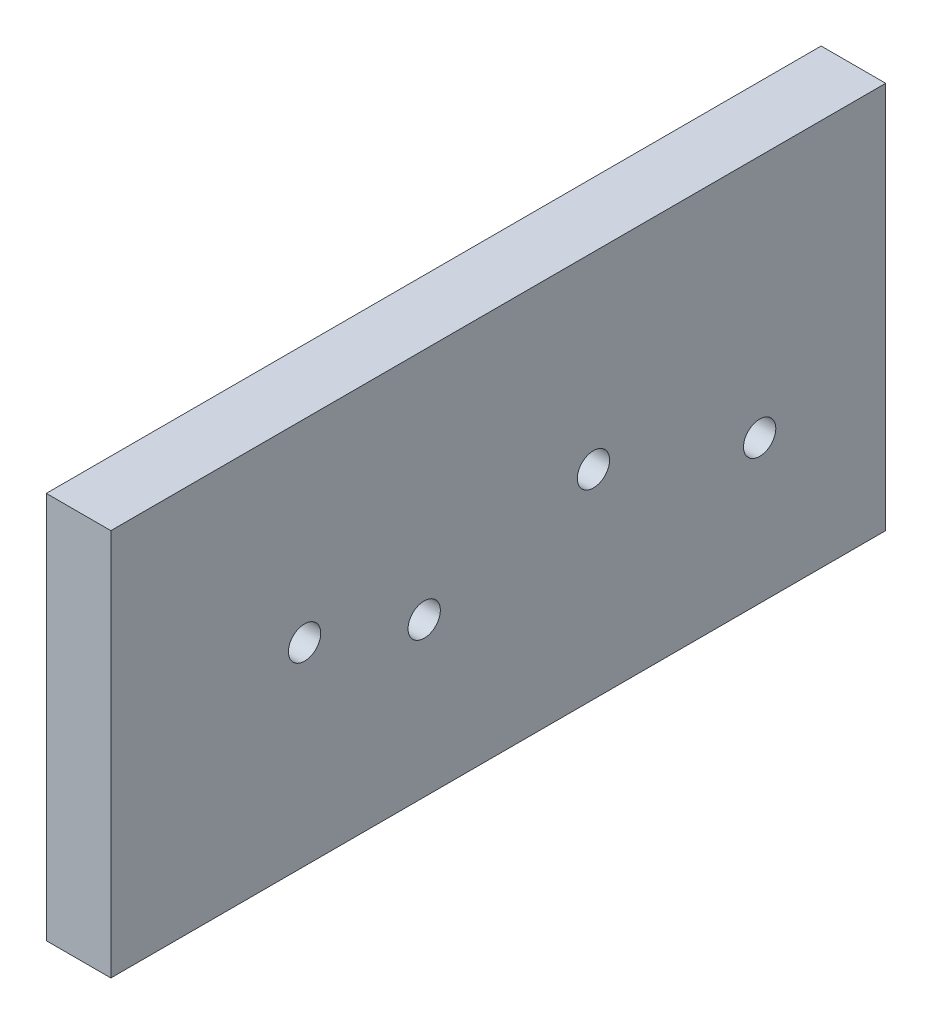
ISO-10303-21;
HEADER;
FILE_DESCRIPTION(('STEP AP214'),'2;1');
FILE_NAME('part.step','',(''),(''),'','','');
FILE_SCHEMA(('AUTOMOTIVE_DESIGN { 1 0 10303 214 1 1 1 1 }'));
ENDSEC;
DATA;
#1=APPLICATION_CONTEXT('core data for automotive mechanical design processes');
#2=APPLICATION_PROTOCOL_DEFINITION('international standard','automotive_design',2000,#1);
#3=PRODUCT_CONTEXT('',#1,'mechanical');
#4=PRODUCT('Part','Part','',(#3));
#5=PRODUCT_RELATED_PRODUCT_CATEGORY('part','',(#4));
#6=PRODUCT_DEFINITION_FORMATION('','',#4);
#7=PRODUCT_DEFINITION_CONTEXT('part definition',#1,'design');
#8=PRODUCT_DEFINITION('design','',#6,#7);
#9=PRODUCT_DEFINITION_SHAPE('','',#8);
#10=(LENGTH_UNIT() NAMED_UNIT(*) SI_UNIT(.MILLI.,.METRE.));
#11=(NAMED_UNIT(*) PLANE_ANGLE_UNIT() SI_UNIT($,.RADIAN.));
#12=(NAMED_UNIT(*) SI_UNIT($,.STERADIAN.) SOLID_ANGLE_UNIT());
#13=UNCERTAINTY_MEASURE_WITH_UNIT(LENGTH_MEASURE(1.E-05),#10,'distance_accuracy_value','');
#14=(GEOMETRIC_REPRESENTATION_CONTEXT(3) GLOBAL_UNCERTAINTY_ASSIGNED_CONTEXT((#13)) GLOBAL_UNIT_ASSIGNED_CONTEXT((#10,
#11,#12)) REPRESENTATION_CONTEXT('',''));
#15=CARTESIAN_POINT('',(0.,0.,0.));
#16=DIRECTION('',(0.,0.,1.));
#17=DIRECTION('',(1.,0.,0.));
#18=AXIS2_PLACEMENT_3D('',#15,#16,#17);
#19=CARTESIAN_POINT('',(12.7,-9.873506971,-51.4082559918149));
#20=DIRECTION('',(-1.,0.,0.));
#21=DIRECTION('',(0.,0.,1.));
#22=AXIS2_PLACEMENT_3D('',#19,#20,#21);
#23=CYLINDRICAL_SURFACE('',#22,3.175);
#24=CARTESIAN_POINT('',(12.7,-9.873506971,-51.4082559918149));
#25=DIRECTION('',(1.,0.,0.));
#26=DIRECTION('',(0.,0.,-1.));
#27=AXIS2_PLACEMENT_3D('',#24,#25,#26);
#28=CIRCLE('',#27,3.175);
#29=CARTESIAN_POINT('',(12.7,-9.873506971,-54.5832559918149));
#30=VERTEX_POINT('',#29);
#31=EDGE_CURVE('E191',#30,#30,#28,.T.);
#32=ORIENTED_EDGE('',*,*,#31,.T.);
#33=EDGE_LOOP('',(#32));
#34=FACE_BOUND('',#33,.T.);
#35=CARTESIAN_POINT('',(6.35,-9.873506971,-51.4082559918149));
#36=DIRECTION('',(-1.,0.,0.));
#37=DIRECTION('',(0.,0.,1.));
#38=AXIS2_PLACEMENT_3D('',#35,#36,#37);
#39=CIRCLE('',#38,3.175);
#40=CARTESIAN_POINT('',(6.35,-9.873506971,-48.2332559918149));
#41=VERTEX_POINT('',#40);
#42=EDGE_CURVE('E51',#41,#41,#39,.T.);
#43=ORIENTED_EDGE('',*,*,#42,.T.);
#44=EDGE_LOOP('',(#43));
#45=FACE_BOUND('',#44,.T.);
#46=ADVANCED_FACE('F47',(#34,#45),#23,.F.);
#47=CARTESIAN_POINT('',(12.7,1.096077429,-18.7225315801618));
#48=DIRECTION('',(-1.,0.,0.));
#49=DIRECTION('',(0.,0.,1.));
#50=AXIS2_PLACEMENT_3D('',#47,#48,#49);
#51=CYLINDRICAL_SURFACE('',#50,3.175);
#52=CARTESIAN_POINT('',(12.7,1.096077429,-18.7225315801618));
#53=DIRECTION('',(1.,0.,0.));
#54=DIRECTION('',(0.,0.,-1.));
#55=AXIS2_PLACEMENT_3D('',#52,#53,#54);
#56=CIRCLE('',#55,3.175);
#57=CARTESIAN_POINT('',(12.7,1.096077429,-21.8975315801618));
#58=VERTEX_POINT('',#57);
#59=EDGE_CURVE('E187',#58,#58,#56,.T.);
#60=ORIENTED_EDGE('',*,*,#59,.T.);
#61=EDGE_LOOP('',(#60));
#62=FACE_BOUND('',#61,.T.);
#63=CARTESIAN_POINT('',(6.35,1.096077429,-18.7225315801618));
#64=DIRECTION('',(-1.,0.,0.));
#65=DIRECTION('',(0.,0.,1.));
#66=AXIS2_PLACEMENT_3D('',#63,#64,#65);
#67=CIRCLE('',#66,3.175);
#68=CARTESIAN_POINT('',(6.35,1.096077429,-15.5475315801618));
#69=VERTEX_POINT('',#68);
#70=EDGE_CURVE('E225',#69,#69,#67,.T.);
#71=ORIENTED_EDGE('',*,*,#70,.T.);
#72=EDGE_LOOP('',(#71));
#73=FACE_BOUND('',#72,.T.);
#74=ADVANCED_FACE('F270',(#62,#73),#51,.F.);
#75=CARTESIAN_POINT('',(12.7,0.,38.1));
#76=DIRECTION('',(-1.,0.,0.));
#77=DIRECTION('',(0.,0.,1.));
#78=AXIS2_PLACEMENT_3D('',#75,#76,#77);
#79=CYLINDRICAL_SURFACE('',#78,3.175);
#80=CARTESIAN_POINT('',(12.7,0.,38.1));
#81=DIRECTION('',(1.,0.,0.));
#82=DIRECTION('',(0.,0.,-1.));
#83=AXIS2_PLACEMENT_3D('',#80,#81,#82);
#84=CIRCLE('',#83,3.175);
#85=CARTESIAN_POINT('',(12.7,0.,34.925));
#86=VERTEX_POINT('',#85);
#87=EDGE_CURVE('E183',#86,#86,#84,.T.);
#88=ORIENTED_EDGE('',*,*,#87,.T.);
#89=EDGE_LOOP('',(#88));
#90=FACE_BOUND('',#89,.T.);
#91=CARTESIAN_POINT('',(6.35,0.,38.1));
#92=DIRECTION('',(-1.,0.,0.));
#93=DIRECTION('',(0.,0.,1.));
#94=AXIS2_PLACEMENT_3D('',#91,#92,#93);
#95=CIRCLE('',#94,3.175);
#96=CARTESIAN_POINT('',(6.35,0.,41.275));
#97=VERTEX_POINT('',#96);
#98=EDGE_CURVE('E222',#97,#97,#95,.T.);
#99=ORIENTED_EDGE('',*,*,#98,.T.);
#100=EDGE_LOOP('',(#99));
#101=FACE_BOUND('',#100,.T.);
#102=ADVANCED_FACE('F276',(#90,#101),#79,.F.);
#103=CARTESIAN_POINT('',(12.7,-7.860160654,14.5712240149026));
#104=DIRECTION('',(-1.,0.,0.));
#105=DIRECTION('',(0.,0.,1.));
#106=AXIS2_PLACEMENT_3D('',#103,#104,#105);
#107=CYLINDRICAL_SURFACE('',#106,3.17500000000001);
#108=CARTESIAN_POINT('',(12.7,-7.860160654,14.5712240149026));
#109=DIRECTION('',(1.,0.,0.));
#110=DIRECTION('',(0.,0.,-1.));
#111=AXIS2_PLACEMENT_3D('',#108,#109,#110);
#112=CIRCLE('',#111,3.17500000000001);
#113=CARTESIAN_POINT('',(12.7,-7.860160654,11.3962240149026));
#114=VERTEX_POINT('',#113);
#115=EDGE_CURVE('E195',#114,#114,#112,.T.);
#116=ORIENTED_EDGE('',*,*,#115,.T.);
#117=EDGE_LOOP('',(#116));
#118=FACE_BOUND('',#117,.T.);
#119=CARTESIAN_POINT('',(6.35,-7.860160654,14.5712240149026));
#120=DIRECTION('',(-1.,0.,0.));
#121=DIRECTION('',(0.,0.,1.));
#122=AXIS2_PLACEMENT_3D('',#119,#120,#121);
#123=CIRCLE('',#122,3.17500000000001);
#124=CARTESIAN_POINT('',(6.35,-7.860160654,17.7462240149026));
#125=VERTEX_POINT('',#124);
#126=EDGE_CURVE('E142',#125,#125,#123,.T.);
#127=ORIENTED_EDGE('',*,*,#126,.T.);
#128=EDGE_LOOP('',(#127));
#129=FACE_BOUND('',#128,.T.);
#130=ADVANCED_FACE('F280',(#118,#129),#107,.F.);
#131=CARTESIAN_POINT('',(12.7,-38.1,0.));
#132=DIRECTION('',(0.,1.,0.));
#133=DIRECTION('',(0.,0.,1.));
#134=AXIS2_PLACEMENT_3D('',#131,#132,#133);
#135=PLANE('',#134);
#136=CARTESIAN_POINT('',(6.35000000000001,-38.1,0.));
#137=DIRECTION('',(0.,-1.,0.));
#138=DIRECTION('',(0.,0.,-1.));
#139=AXIS2_PLACEMENT_3D('',#136,#137,#138);
#140=CIRCLE('',#139,3.17499999999999);
#141=CARTESIAN_POINT('',(6.35000000000001,-38.1,-3.17499999999999));
#142=VERTEX_POINT('',#141);
#143=EDGE_CURVE('E116',#142,#142,#140,.T.);
#144=ORIENTED_EDGE('',*,*,#143,.F.);
#145=EDGE_LOOP('',(#144));
#146=FACE_BOUND('',#145,.T.);
#147=CARTESIAN_POINT('',(6.35,-38.1,57.15));
#148=DIRECTION('',(0.,-1.,0.));
#149=DIRECTION('',(0.,0.,-1.));
#150=AXIS2_PLACEMENT_3D('',#147,#148,#149);
#151=CIRCLE('',#150,3.17499999999999);
#152=CARTESIAN_POINT('',(6.35,-38.1,53.975));
#153=VERTEX_POINT('',#152);
#154=EDGE_CURVE('E115',#153,#153,#151,.T.);
#155=ORIENTED_EDGE('',*,*,#154,.F.);
#156=EDGE_LOOP('',(#155));
#157=FACE_BOUND('',#156,.T.);
#158=CARTESIAN_POINT('',(6.35000000000002,-38.1,-63.5));
#159=DIRECTION('',(0.,-1.,0.));
#160=DIRECTION('',(0.,0.,-1.));
#161=AXIS2_PLACEMENT_3D('',#158,#159,#160);
#162=CIRCLE('',#161,3.17499999999999);
#163=CARTESIAN_POINT('',(6.35000000000002,-38.1,-66.675));
#164=VERTEX_POINT('',#163);
#165=EDGE_CURVE('E129',#164,#164,#162,.T.);
#166=ORIENTED_EDGE('',*,*,#165,.F.);
#167=EDGE_LOOP('',(#166));
#168=FACE_BOUND('',#167,.T.);
#169=DIRECTION('',(0.,0.,-1.));
#170=VECTOR('',#169,1.);
#171=CARTESIAN_POINT('',(0.,-38.1,0.));
#172=LINE('',#171,#170);
#173=CARTESIAN_POINT('',(0.,-38.1,76.2));
#174=VERTEX_POINT('',#173);
#175=CARTESIAN_POINT('',(0.,-38.1,-76.2));
#176=VERTEX_POINT('',#175);
#177=EDGE_CURVE('E199',#174,#176,#172,.T.);
#178=ORIENTED_EDGE('',*,*,#177,.T.);
#179=DIRECTION('',(-1.,0.,0.));
#180=VECTOR('',#179,1.);
#181=CARTESIAN_POINT('',(12.7,-38.1,-76.2));
#182=LINE('',#181,#180);
#183=CARTESIAN_POINT('',(12.7,-38.1,-76.2));
#184=VERTEX_POINT('',#183);
#185=EDGE_CURVE('E11',#184,#176,#182,.T.);
#186=ORIENTED_EDGE('',*,*,#185,.F.);
#187=DIRECTION('',(0.,0.,-1.));
#188=VECTOR('',#187,1.);
#189=CARTESIAN_POINT('',(12.7,-38.1,0.));
#190=LINE('',#189,#188);
#191=CARTESIAN_POINT('',(12.7,-38.1,76.2));
#192=VERTEX_POINT('',#191);
#193=EDGE_CURVE('E170',#192,#184,#190,.T.);
#194=ORIENTED_EDGE('',*,*,#193,.F.);
#195=DIRECTION('',(-1.,0.,0.));
#196=VECTOR('',#195,1.);
#197=CARTESIAN_POINT('',(12.7,-38.1,76.2));
#198=LINE('',#197,#196);
#199=EDGE_CURVE('E67',#192,#174,#198,.T.);
#200=ORIENTED_EDGE('',*,*,#199,.T.);
#201=EDGE_LOOP('',(#178,#186,#194,#200));
#202=FACE_BOUND('',#201,.T.);
#203=ADVANCED_FACE('F49',(#146,#157,#168,#202),#135,.F.);
#204=CARTESIAN_POINT('',(12.7,0.,-76.2));
#205=DIRECTION('',(0.,0.,1.));
#206=DIRECTION('',(1.,0.,0.));
#207=AXIS2_PLACEMENT_3D('',#204,#205,#206);
#208=PLANE('',#207);
#209=DIRECTION('',(0.,1.,0.));
#210=VECTOR('',#209,1.);
#211=CARTESIAN_POINT('',(0.,0.,-76.2));
#212=LINE('',#211,#210);
#213=CARTESIAN_POINT('',(0.,38.1,-76.2));
#214=VERTEX_POINT('',#213);
#215=EDGE_CURVE('E202',#176,#214,#212,.T.);
#216=ORIENTED_EDGE('',*,*,#215,.T.);
#217=DIRECTION('',(-1.,0.,0.));
#218=VECTOR('',#217,1.);
#219=CARTESIAN_POINT('',(12.7,38.1,-76.2));
#220=LINE('',#219,#218);
#221=CARTESIAN_POINT('',(12.7,38.1,-76.2));
#222=VERTEX_POINT('',#221);
#223=EDGE_CURVE('E58',#222,#214,#220,.T.);
#224=ORIENTED_EDGE('',*,*,#223,.F.);
#225=DIRECTION('',(0.,1.,0.));
#226=VECTOR('',#225,1.);
#227=CARTESIAN_POINT('',(12.7,0.,-76.2));
#228=LINE('',#227,#226);
#229=EDGE_CURVE('E93',#184,#222,#228,.T.);
#230=ORIENTED_EDGE('',*,*,#229,.F.);
#231=ORIENTED_EDGE('',*,*,#185,.T.);
#232=EDGE_LOOP('',(#216,#224,#230,#231));
#233=FACE_BOUND('',#232,.T.);
#234=ADVANCED_FACE('F265',(#233),#208,.F.);
#235=CARTESIAN_POINT('',(12.7,38.1,0.));
#236=DIRECTION('',(0.,1.,0.));
#237=DIRECTION('',(0.,0.,1.));
#238=AXIS2_PLACEMENT_3D('',#235,#236,#237);
#239=PLANE('',#238);
#240=DIRECTION('',(0.,0.,-1.));
#241=VECTOR('',#240,1.);
#242=CARTESIAN_POINT('',(0.,38.1,0.));
#243=LINE('',#242,#241);
#244=CARTESIAN_POINT('',(0.,38.1,76.2));
#245=VERTEX_POINT('',#244);
#246=EDGE_CURVE('E206',#245,#214,#243,.T.);
#247=ORIENTED_EDGE('',*,*,#246,.F.);
#248=DIRECTION('',(-1.,0.,0.));
#249=VECTOR('',#248,1.);
#250=CARTESIAN_POINT('',(12.7,38.1,76.2));
#251=LINE('',#250,#249);
#252=CARTESIAN_POINT('',(12.7,38.1,76.2));
#253=VERTEX_POINT('',#252);
#254=EDGE_CURVE('E82',#253,#245,#251,.T.);
#255=ORIENTED_EDGE('',*,*,#254,.F.);
#256=DIRECTION('',(0.,0.,-1.));
#257=VECTOR('',#256,1.);
#258=CARTESIAN_POINT('',(12.7,38.1,0.));
#259=LINE('',#258,#257);
#260=EDGE_CURVE('E176',#253,#222,#259,.T.);
#261=ORIENTED_EDGE('',*,*,#260,.T.);
#262=ORIENTED_EDGE('',*,*,#223,.T.);
#263=EDGE_LOOP('',(#247,#255,#261,#262));
#264=FACE_BOUND('',#263,.T.);
#265=ADVANCED_FACE('F257',(#264),#239,.T.);
#266=CARTESIAN_POINT('',(12.7,0.,76.2));
#267=DIRECTION('',(0.,0.,1.));
#268=DIRECTION('',(1.,0.,0.));
#269=AXIS2_PLACEMENT_3D('',#266,#267,#268);
#270=PLANE('',#269);
#271=DIRECTION('',(0.,1.,0.));
#272=VECTOR('',#271,1.);
#273=CARTESIAN_POINT('',(0.,0.,76.2));
#274=LINE('',#273,#272);
#275=EDGE_CURVE('E173',#174,#245,#274,.T.);
#276=ORIENTED_EDGE('',*,*,#275,.F.);
#277=ORIENTED_EDGE('',*,*,#199,.F.);
#278=DIRECTION('',(0.,1.,0.));
#279=VECTOR('',#278,1.);
#280=CARTESIAN_POINT('',(12.7,0.,76.2));
#281=LINE('',#280,#279);
#282=EDGE_CURVE('E180',#192,#253,#281,.T.);
#283=ORIENTED_EDGE('',*,*,#282,.T.);
#284=ORIENTED_EDGE('',*,*,#254,.T.);
#285=EDGE_LOOP('',(#276,#277,#283,#284));
#286=FACE_BOUND('',#285,.T.);
#287=ADVANCED_FACE('F255',(#286),#270,.T.);
#288=CARTESIAN_POINT('',(12.7,0.,0.));
#289=DIRECTION('',(1.,0.,0.));
#290=DIRECTION('',(0.,0.,-1.));
#291=AXIS2_PLACEMENT_3D('',#288,#289,#290);
#292=PLANE('',#291);
#293=ORIENTED_EDGE('',*,*,#193,.T.);
#294=ORIENTED_EDGE('',*,*,#229,.T.);
#295=ORIENTED_EDGE('',*,*,#260,.F.);
#296=ORIENTED_EDGE('',*,*,#282,.F.);
#297=EDGE_LOOP('',(#293,#294,#295,#296));
#298=FACE_BOUND('',#297,.T.);
#299=ORIENTED_EDGE('',*,*,#87,.F.);
#300=EDGE_LOOP('',(#299));
#301=FACE_BOUND('',#300,.T.);
#302=ORIENTED_EDGE('',*,*,#59,.F.);
#303=EDGE_LOOP('',(#302));
#304=FACE_BOUND('',#303,.T.);
#305=ORIENTED_EDGE('',*,*,#31,.F.);
#306=EDGE_LOOP('',(#305));
#307=FACE_BOUND('',#306,.T.);
#308=ORIENTED_EDGE('',*,*,#115,.F.);
#309=EDGE_LOOP('',(#308));
#310=FACE_BOUND('',#309,.T.);
#311=ADVANCED_FACE('F251',(#298,#301,#304,#307,#310),#292,.T.);
#312=CARTESIAN_POINT('',(0.,0.,0.));
#313=DIRECTION('',(1.,0.,0.));
#314=DIRECTION('',(0.,0.,-1.));
#315=AXIS2_PLACEMENT_3D('',#312,#313,#314);
#316=PLANE('',#315);
#317=CARTESIAN_POINT('',(0.,0.,38.1));
#318=DIRECTION('',(-1.,0.,0.));
#319=DIRECTION('',(0.,0.,1.));
#320=AXIS2_PLACEMENT_3D('',#317,#318,#319);
#321=CIRCLE('',#320,7.9375);
#322=CARTESIAN_POINT('',(0.,0.,46.0375));
#323=VERTEX_POINT('',#322);
#324=EDGE_CURVE('E143',#323,#323,#321,.T.);
#325=ORIENTED_EDGE('',*,*,#324,.F.);
#326=EDGE_LOOP('',(#325));
#327=FACE_BOUND('',#326,.T.);
#328=CARTESIAN_POINT('',(0.,-7.860160654,14.5712240149026));
#329=DIRECTION('',(-1.,0.,0.));
#330=DIRECTION('',(0.,0.,1.));
#331=AXIS2_PLACEMENT_3D('',#328,#329,#330);
#332=CIRCLE('',#331,7.9375);
#333=CARTESIAN_POINT('',(0.,-7.860160654,22.5087240149026));
#334=VERTEX_POINT('',#333);
#335=EDGE_CURVE('E147',#334,#334,#332,.T.);
#336=ORIENTED_EDGE('',*,*,#335,.F.);
#337=EDGE_LOOP('',(#336));
#338=FACE_BOUND('',#337,.T.);
#339=CARTESIAN_POINT('',(0.,1.096077429,-18.7225315801618));
#340=DIRECTION('',(-1.,0.,0.));
#341=DIRECTION('',(0.,0.,1.));
#342=AXIS2_PLACEMENT_3D('',#339,#340,#341);
#343=CIRCLE('',#342,7.9375);
#344=CARTESIAN_POINT('',(0.,1.096077429,-10.7850315801618));
#345=VERTEX_POINT('',#344);
#346=EDGE_CURVE('E155',#345,#345,#343,.T.);
#347=ORIENTED_EDGE('',*,*,#346,.F.);
#348=EDGE_LOOP('',(#347));
#349=FACE_BOUND('',#348,.T.);
#350=CARTESIAN_POINT('',(0.,-9.873506971,-51.4082559918149));
#351=DIRECTION('',(-1.,0.,0.));
#352=DIRECTION('',(0.,0.,1.));
#353=AXIS2_PLACEMENT_3D('',#350,#351,#352);
#354=CIRCLE('',#353,7.9375);
#355=CARTESIAN_POINT('',(0.,-9.873506971,-43.4707559918149));
#356=VERTEX_POINT('',#355);
#357=EDGE_CURVE('E163',#356,#356,#354,.T.);
#358=ORIENTED_EDGE('',*,*,#357,.F.);
#359=EDGE_LOOP('',(#358));
#360=FACE_BOUND('',#359,.T.);
#361=ORIENTED_EDGE('',*,*,#177,.F.);
#362=ORIENTED_EDGE('',*,*,#275,.T.);
#363=ORIENTED_EDGE('',*,*,#246,.T.);
#364=ORIENTED_EDGE('',*,*,#215,.F.);
#365=EDGE_LOOP('',(#361,#362,#363,#364));
#366=FACE_BOUND('',#365,.T.);
#367=ADVANCED_FACE('F245',(#327,#338,#349,#360,#366),#316,.F.);
#368=CARTESIAN_POINT('',(6.35,-9.873506971,-51.4082559918149));
#369=DIRECTION('',(-1.,0.,0.));
#370=DIRECTION('',(0.,0.,1.));
#371=AXIS2_PLACEMENT_3D('',#368,#369,#370);
#372=CYLINDRICAL_SURFACE('',#371,7.9375);
#373=CARTESIAN_POINT('',(6.35,-9.873506971,-51.4082559918149));
#374=DIRECTION('',(-1.,0.,0.));
#375=DIRECTION('',(0.,0.,1.));
#376=AXIS2_PLACEMENT_3D('',#373,#374,#375);
#377=CIRCLE('',#376,7.9375);
#378=CARTESIAN_POINT('',(6.35,-9.873506971,-43.4707559918149));
#379=VERTEX_POINT('',#378);
#380=EDGE_CURVE('E137',#379,#379,#377,.T.);
#381=ORIENTED_EDGE('',*,*,#380,.F.);
#382=EDGE_LOOP('',(#381));
#383=FACE_BOUND('',#382,.T.);
#384=ORIENTED_EDGE('',*,*,#357,.T.);
#385=EDGE_LOOP('',(#384));
#386=FACE_BOUND('',#385,.T.);
#387=ADVANCED_FACE('F239',(#383,#386),#372,.F.);
#388=CARTESIAN_POINT('',(6.35,-9.873506971,-51.4082559918149));
#389=DIRECTION('',(-1.,0.,0.));
#390=DIRECTION('',(0.,0.,1.));
#391=AXIS2_PLACEMENT_3D('',#388,#389,#390);
#392=PLANE('',#391);
#393=ORIENTED_EDGE('',*,*,#42,.F.);
#394=EDGE_LOOP('',(#393));
#395=FACE_BOUND('',#394,.T.);
#396=ORIENTED_EDGE('',*,*,#380,.T.);
#397=EDGE_LOOP('',(#396));
#398=FACE_BOUND('',#397,.T.);
#399=ADVANCED_FACE('F235',(#395,#398),#392,.T.);
#400=CARTESIAN_POINT('',(6.35,1.096077429,-18.7225315801618));
#401=DIRECTION('',(-1.,0.,0.));
#402=DIRECTION('',(0.,0.,1.));
#403=AXIS2_PLACEMENT_3D('',#400,#401,#402);
#404=CYLINDRICAL_SURFACE('',#403,7.9375);
#405=CARTESIAN_POINT('',(6.35,1.096077429,-18.7225315801618));
#406=DIRECTION('',(-1.,0.,0.));
#407=DIRECTION('',(0.,0.,1.));
#408=AXIS2_PLACEMENT_3D('',#405,#406,#407);
#409=CIRCLE('',#408,7.9375);
#410=CARTESIAN_POINT('',(6.35,1.096077429,-10.7850315801618));
#411=VERTEX_POINT('',#410);
#412=EDGE_CURVE('E159',#411,#411,#409,.T.);
#413=ORIENTED_EDGE('',*,*,#412,.F.);
#414=EDGE_LOOP('',(#413));
#415=FACE_BOUND('',#414,.T.);
#416=ORIENTED_EDGE('',*,*,#346,.T.);
#417=EDGE_LOOP('',(#416));
#418=FACE_BOUND('',#417,.T.);
#419=ADVANCED_FACE('F238',(#415,#418),#404,.F.);
#420=CARTESIAN_POINT('',(6.35,1.096077429,-18.7225315801618));
#421=DIRECTION('',(-1.,0.,0.));
#422=DIRECTION('',(0.,0.,1.));
#423=AXIS2_PLACEMENT_3D('',#420,#421,#422);
#424=PLANE('',#423);
#425=ORIENTED_EDGE('',*,*,#70,.F.);
#426=EDGE_LOOP('',(#425));
#427=FACE_BOUND('',#426,.T.);
#428=ORIENTED_EDGE('',*,*,#412,.T.);
#429=EDGE_LOOP('',(#428));
#430=FACE_BOUND('',#429,.T.);
#431=ADVANCED_FACE('F310',(#427,#430),#424,.T.);
#432=CARTESIAN_POINT('',(6.35,-7.860160654,14.5712240149026));
#433=DIRECTION('',(-1.,0.,0.));
#434=DIRECTION('',(0.,0.,1.));
#435=AXIS2_PLACEMENT_3D('',#432,#433,#434);
#436=CYLINDRICAL_SURFACE('',#435,7.9375);
#437=CARTESIAN_POINT('',(6.35,-7.860160654,14.5712240149026));
#438=DIRECTION('',(-1.,0.,0.));
#439=DIRECTION('',(0.,0.,1.));
#440=AXIS2_PLACEMENT_3D('',#437,#438,#439);
#441=CIRCLE('',#440,7.9375);
#442=CARTESIAN_POINT('',(6.35,-7.860160654,22.5087240149026));
#443=VERTEX_POINT('',#442);
#444=EDGE_CURVE('E151',#443,#443,#441,.T.);
#445=ORIENTED_EDGE('',*,*,#444,.F.);
#446=EDGE_LOOP('',(#445));
#447=FACE_BOUND('',#446,.T.);
#448=ORIENTED_EDGE('',*,*,#335,.T.);
#449=EDGE_LOOP('',(#448));
#450=FACE_BOUND('',#449,.T.);
#451=ADVANCED_FACE('F316',(#447,#450),#436,.F.);
#452=CARTESIAN_POINT('',(6.35,-7.860160654,14.5712240149026));
#453=DIRECTION('',(-1.,0.,0.));
#454=DIRECTION('',(0.,0.,1.));
#455=AXIS2_PLACEMENT_3D('',#452,#453,#454);
#456=PLANE('',#455);
#457=ORIENTED_EDGE('',*,*,#126,.F.);
#458=EDGE_LOOP('',(#457));
#459=FACE_BOUND('',#458,.T.);
#460=ORIENTED_EDGE('',*,*,#444,.T.);
#461=EDGE_LOOP('',(#460));
#462=FACE_BOUND('',#461,.T.);
#463=ADVANCED_FACE('F301',(#459,#462),#456,.T.);
#464=CARTESIAN_POINT('',(6.35,0.,38.1));
#465=DIRECTION('',(-1.,0.,0.));
#466=DIRECTION('',(0.,0.,1.));
#467=AXIS2_PLACEMENT_3D('',#464,#465,#466);
#468=CYLINDRICAL_SURFACE('',#467,7.9375);
#469=CARTESIAN_POINT('',(6.35,0.,38.1));
#470=DIRECTION('',(-1.,0.,0.));
#471=DIRECTION('',(0.,0.,1.));
#472=AXIS2_PLACEMENT_3D('',#469,#470,#471);
#473=CIRCLE('',#472,7.9375);
#474=CARTESIAN_POINT('',(6.35,0.,46.0375));
#475=VERTEX_POINT('',#474);
#476=EDGE_CURVE('E138',#475,#475,#473,.T.);
#477=ORIENTED_EDGE('',*,*,#476,.F.);
#478=EDGE_LOOP('',(#477));
#479=FACE_BOUND('',#478,.T.);
#480=ORIENTED_EDGE('',*,*,#324,.T.);
#481=EDGE_LOOP('',(#480));
#482=FACE_BOUND('',#481,.T.);
#483=ADVANCED_FACE('F295',(#479,#482),#468,.F.);
#484=CARTESIAN_POINT('',(6.35,0.,38.1));
#485=DIRECTION('',(-1.,0.,0.));
#486=DIRECTION('',(0.,0.,1.));
#487=AXIS2_PLACEMENT_3D('',#484,#485,#486);
#488=PLANE('',#487);
#489=ORIENTED_EDGE('',*,*,#98,.F.);
#490=EDGE_LOOP('',(#489));
#491=FACE_BOUND('',#490,.T.);
#492=ORIENTED_EDGE('',*,*,#476,.T.);
#493=EDGE_LOOP('',(#492));
#494=FACE_BOUND('',#493,.T.);
#495=ADVANCED_FACE('F291',(#491,#494),#488,.T.);
#496=CARTESIAN_POINT('',(6.35000000000002,-25.4,-63.5));
#497=DIRECTION('',(0.,-1.,0.));
#498=DIRECTION('',(0.,0.,-1.));
#499=AXIS2_PLACEMENT_3D('',#496,#497,#498);
#500=CONICAL_SURFACE('',#499,3.17499999999999,1.02974425867665);
#501=CARTESIAN_POINT('',(6.35000000000001,-23.4922675345875,-63.5));
#502=VERTEX_POINT('',#501);
#503=VERTEX_LOOP('',#502);
#504=FACE_BOUND('',#503,.T.);
#505=CARTESIAN_POINT('',(6.35000000000002,-25.4,-63.5));
#506=DIRECTION('',(0.,-1.,0.));
#507=DIRECTION('',(0.,0.,-1.));
#508=AXIS2_PLACEMENT_3D('',#505,#506,#507);
#509=CIRCLE('',#508,3.17499999999999);
#510=CARTESIAN_POINT('',(6.35000000000002,-25.4,-66.675));
#511=VERTEX_POINT('',#510);
#512=EDGE_CURVE('E133',#511,#511,#509,.T.);
#513=ORIENTED_EDGE('',*,*,#512,.T.);
#514=EDGE_LOOP('',(#513));
#515=FACE_BOUND('',#514,.T.);
#516=ADVANCED_FACE('F294',(#504,#515),#500,.F.);
#517=CARTESIAN_POINT('',(6.35000000000002,-38.1,-63.5));
#518=DIRECTION('',(0.,-1.,0.));
#519=DIRECTION('',(0.,0.,-1.));
#520=AXIS2_PLACEMENT_3D('',#517,#518,#519);
#521=CYLINDRICAL_SURFACE('',#520,3.17499999999999);
#522=ORIENTED_EDGE('',*,*,#512,.F.);
#523=EDGE_LOOP('',(#522));
#524=FACE_BOUND('',#523,.T.);
#525=ORIENTED_EDGE('',*,*,#165,.T.);
#526=EDGE_LOOP('',(#525));
#527=FACE_BOUND('',#526,.T.);
#528=ADVANCED_FACE('F329',(#524,#527),#521,.F.);
#529=CARTESIAN_POINT('',(6.35,-25.4,57.15));
#530=DIRECTION('',(0.,-1.,0.));
#531=DIRECTION('',(0.,0.,-1.));
#532=AXIS2_PLACEMENT_3D('',#529,#530,#531);
#533=CONICAL_SURFACE('',#532,3.17499999999999,1.02974425867665);
#534=CARTESIAN_POINT('',(6.35,-23.4922675345875,57.15));
#535=VERTEX_POINT('',#534);
#536=VERTEX_LOOP('',#535);
#537=FACE_BOUND('',#536,.T.);
#538=CARTESIAN_POINT('',(6.35,-25.4,57.15));
#539=DIRECTION('',(0.,-1.,0.));
#540=DIRECTION('',(0.,0.,-1.));
#541=AXIS2_PLACEMENT_3D('',#538,#539,#540);
#542=CIRCLE('',#541,3.17499999999999);
#543=CARTESIAN_POINT('',(6.35,-25.4,53.975));
#544=VERTEX_POINT('',#543);
#545=EDGE_CURVE('E121',#544,#544,#542,.T.);
#546=ORIENTED_EDGE('',*,*,#545,.T.);
#547=EDGE_LOOP('',(#546));
#548=FACE_BOUND('',#547,.T.);
#549=ADVANCED_FACE('F333',(#537,#548),#533,.F.);
#550=CARTESIAN_POINT('',(6.35,-38.1,57.15));
#551=DIRECTION('',(0.,-1.,0.));
#552=DIRECTION('',(0.,0.,-1.));
#553=AXIS2_PLACEMENT_3D('',#550,#551,#552);
#554=CYLINDRICAL_SURFACE('',#553,3.17499999999999);
#555=ORIENTED_EDGE('',*,*,#545,.F.);
#556=EDGE_LOOP('',(#555));
#557=FACE_BOUND('',#556,.T.);
#558=ORIENTED_EDGE('',*,*,#154,.T.);
#559=EDGE_LOOP('',(#558));
#560=FACE_BOUND('',#559,.T.);
#561=ADVANCED_FACE('F108',(#557,#560),#554,.F.);
#562=CARTESIAN_POINT('',(6.35000000000001,-25.4,0.));
#563=DIRECTION('',(0.,-1.,0.));
#564=DIRECTION('',(0.,0.,-1.));
#565=AXIS2_PLACEMENT_3D('',#562,#563,#564);
#566=CONICAL_SURFACE('',#565,3.17499999999999,1.02974425867665);
#567=CARTESIAN_POINT('',(6.35,-23.4922675345875,0.));
#568=VERTEX_POINT('',#567);
#569=VERTEX_LOOP('',#568);
#570=FACE_BOUND('',#569,.T.);
#571=CARTESIAN_POINT('',(6.35000000000001,-25.4,0.));
#572=DIRECTION('',(0.,-1.,0.));
#573=DIRECTION('',(0.,0.,-1.));
#574=AXIS2_PLACEMENT_3D('',#571,#572,#573);
#575=CIRCLE('',#574,3.17499999999999);
#576=CARTESIAN_POINT('',(6.35000000000001,-25.4,-3.17499999999999));
#577=VERTEX_POINT('',#576);
#578=EDGE_CURVE('E112',#577,#577,#575,.T.);
#579=ORIENTED_EDGE('',*,*,#578,.T.);
#580=EDGE_LOOP('',(#579));
#581=FACE_BOUND('',#580,.T.);
#582=ADVANCED_FACE('F104',(#570,#581),#566,.F.);
#583=CARTESIAN_POINT('',(6.35000000000001,-38.1,0.));
#584=DIRECTION('',(0.,-1.,0.));
#585=DIRECTION('',(0.,0.,-1.));
#586=AXIS2_PLACEMENT_3D('',#583,#584,#585);
#587=CYLINDRICAL_SURFACE('',#586,3.17499999999999);
#588=ORIENTED_EDGE('',*,*,#578,.F.);
#589=EDGE_LOOP('',(#588));
#590=FACE_BOUND('',#589,.T.);
#591=ORIENTED_EDGE('',*,*,#143,.T.);
#592=EDGE_LOOP('',(#591));
#593=FACE_BOUND('',#592,.T.);
#594=ADVANCED_FACE('F107',(#590,#593),#587,.F.);
#595=CLOSED_SHELL('',(#46,#74,#102,#130,#203,#234,#265,#287,#311,#367,#387,#399,#419,#431,#451,
#463,#483,#495,#516,#528,#549,#561,#582,#594));
#596=MANIFOLD_SOLID_BREP('B2',#595);
#597=ADVANCED_BREP_SHAPE_REPRESENTATION('',(#18,#596),#14);
#598=SHAPE_DEFINITION_REPRESENTATION(#9,#597);
ENDSEC;
END-ISO-10303-21;
